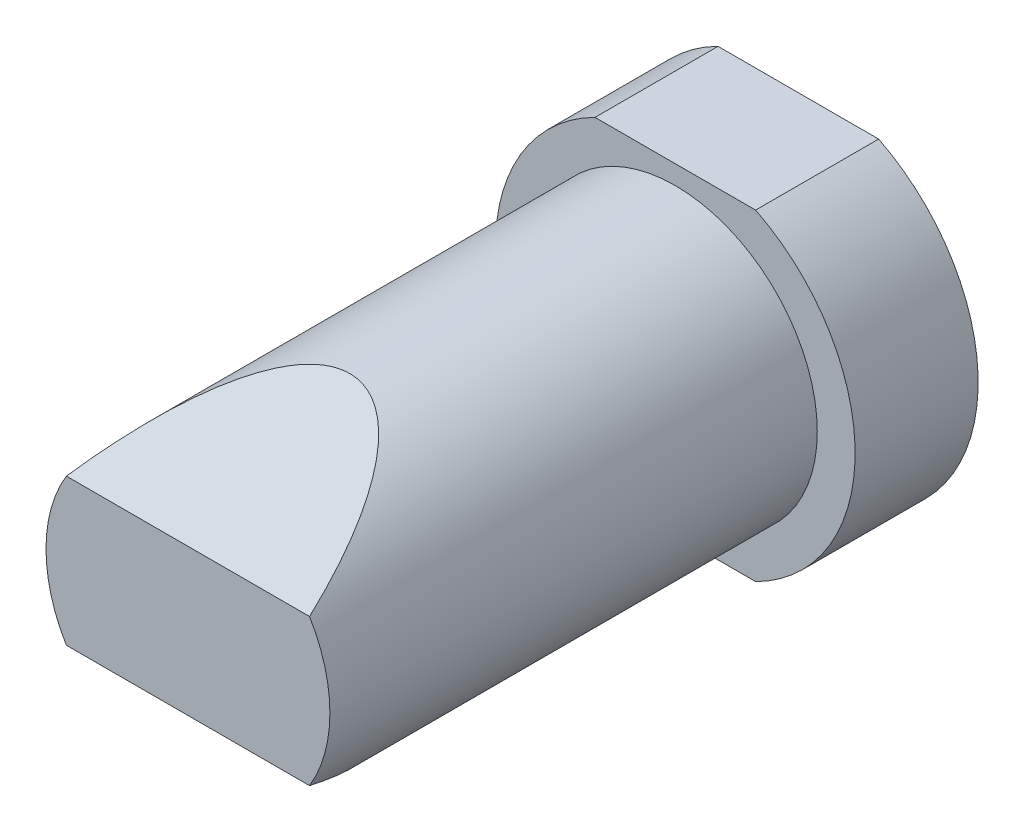
ISO-10303-21;
HEADER;
FILE_DESCRIPTION(('STEP AP214'),'2;1');
FILE_NAME('part.step','',(''),(''),'','','');
FILE_SCHEMA(('AUTOMOTIVE_DESIGN { 1 0 10303 214 1 1 1 1 }'));
ENDSEC;
DATA;
#1=APPLICATION_CONTEXT('core data for automotive mechanical design processes');
#2=APPLICATION_PROTOCOL_DEFINITION('international standard','automotive_design',2000,#1);
#3=PRODUCT_CONTEXT('',#1,'mechanical');
#4=PRODUCT('Part','Part','',(#3));
#5=PRODUCT_RELATED_PRODUCT_CATEGORY('part','',(#4));
#6=PRODUCT_DEFINITION_FORMATION('','',#4);
#7=PRODUCT_DEFINITION_CONTEXT('part definition',#1,'design');
#8=PRODUCT_DEFINITION('design','',#6,#7);
#9=PRODUCT_DEFINITION_SHAPE('','',#8);
#10=(LENGTH_UNIT() NAMED_UNIT(*) SI_UNIT(.MILLI.,.METRE.));
#11=(NAMED_UNIT(*) PLANE_ANGLE_UNIT() SI_UNIT($,.RADIAN.));
#12=(NAMED_UNIT(*) SI_UNIT($,.STERADIAN.) SOLID_ANGLE_UNIT());
#13=UNCERTAINTY_MEASURE_WITH_UNIT(LENGTH_MEASURE(1.E-05),#10,'distance_accuracy_value','');
#14=(GEOMETRIC_REPRESENTATION_CONTEXT(3) GLOBAL_UNCERTAINTY_ASSIGNED_CONTEXT((#13)) GLOBAL_UNIT_ASSIGNED_CONTEXT((#10,
#11,#12)) REPRESENTATION_CONTEXT('',''));
#15=CARTESIAN_POINT('',(0.,0.,0.));
#16=DIRECTION('',(0.,0.,1.));
#17=DIRECTION('',(1.,0.,0.));
#18=AXIS2_PLACEMENT_3D('',#15,#16,#17);
#19=CARTESIAN_POINT('',(0.,0.,-19.6666666665806));
#20=DIRECTION('',(0.,0.,-1.));
#21=DIRECTION('',(-1.,0.,0.));
#22=AXIS2_PLACEMENT_3D('',#19,#20,#21);
#23=CONICAL_SURFACE('',#22,3.99999999979173,1.04719755110444);
#24=CARTESIAN_POINT('',(0.,0.,-19.6666666667));
#25=DIRECTION('',(0.,0.,-1.));
#26=DIRECTION('',(-1.,0.,0.));
#27=AXIS2_PLACEMENT_3D('',#24,#25,#26);
#28=CIRCLE('',#27,4.);
#29=CARTESIAN_POINT('',(-4.,0.,-19.6666666667));
#30=VERTEX_POINT('',#29);
#31=EDGE_CURVE('E155',#30,#30,#28,.T.);
#32=ORIENTED_EDGE('',*,*,#31,.T.);
#33=EDGE_LOOP('',(#32));
#34=FACE_BOUND('',#33,.T.);
#35=CARTESIAN_POINT('',(0.,3.41060513164848E-10,-17.3572655898226));
#36=VERTEX_POINT('',#35);
#37=VERTEX_LOOP('',#36);
#38=FACE_BOUND('',#37,.T.);
#39=ADVANCED_FACE('F17',(#34,#38),#23,.F.);
#40=CARTESIAN_POINT('',(0.,0.,-21.33333333335));
#41=DIRECTION('',(0.,0.,-1.));
#42=DIRECTION('',(-1.,0.,0.));
#43=AXIS2_PLACEMENT_3D('',#40,#41,#42);
#44=CYLINDRICAL_SURFACE('',#43,4.);
#45=ORIENTED_EDGE('',*,*,#31,.F.);
#46=EDGE_LOOP('',(#45));
#47=FACE_BOUND('',#46,.T.);
#48=CARTESIAN_POINT('',(0.,0.,-23.));
#49=DIRECTION('',(0.,0.,-1.));
#50=DIRECTION('',(-1.,0.,0.));
#51=AXIS2_PLACEMENT_3D('',#48,#49,#50);
#52=CIRCLE('',#51,4.);
#53=CARTESIAN_POINT('',(-4.,0.,-23.));
#54=VERTEX_POINT('',#53);
#55=EDGE_CURVE('E20',#54,#54,#52,.F.);
#56=ORIENTED_EDGE('',*,*,#55,.F.);
#57=EDGE_LOOP('',(#56));
#58=FACE_BOUND('',#57,.T.);
#59=ADVANCED_FACE('F76',(#47,#58),#44,.F.);
#60=CARTESIAN_POINT('',(0.,4.4975,-23.));
#61=DIRECTION('',(0.,0.,1.));
#62=DIRECTION('',(1.,0.,0.));
#63=AXIS2_PLACEMENT_3D('',#60,#61,#62);
#64=PLANE('',#63);
#65=ORIENTED_EDGE('',*,*,#55,.T.);
#66=EDGE_LOOP('',(#65));
#67=FACE_BOUND('',#66,.T.);
#68=CARTESIAN_POINT('',(0.,0.,-23.));
#69=DIRECTION('',(0.,0.,-1.));
#70=DIRECTION('',(-1.,0.,0.));
#71=AXIS2_PLACEMENT_3D('',#68,#69,#70);
#72=CIRCLE('',#71,3.995);
#73=CARTESIAN_POINT('',(-3.995,0.,-23.));
#74=VERTEX_POINT('',#73);
#75=EDGE_CURVE('E145',#74,#74,#72,.T.);
#76=ORIENTED_EDGE('',*,*,#75,.T.);
#77=EDGE_LOOP('',(#76));
#78=FACE_BOUND('',#77,.T.);
#79=ADVANCED_FACE('F82',(#67,#78),#64,.T.);
#80=CARTESIAN_POINT('',(0.,0.,-32.4975));
#81=DIRECTION('',(0.,0.,-1.));
#82=DIRECTION('',(-1.,0.,0.));
#83=AXIS2_PLACEMENT_3D('',#80,#81,#82);
#84=CYLINDRICAL_SURFACE('',#83,3.995);
#85=CARTESIAN_POINT('',(0.,0.,-41.9949999999858));
#86=DIRECTION('',(0.,0.,-1.));
#87=DIRECTION('',(0.,1.,0.));
#88=AXIS2_PLACEMENT_3D('',#85,#86,#87);
#89=CIRCLE('',#88,3.99499999997488);
#90=CARTESIAN_POINT('',(0.,3.99499999997488,-41.9949999999858));
#91=VERTEX_POINT('',#90);
#92=EDGE_CURVE('E148',#91,#91,#89,.T.);
#93=ORIENTED_EDGE('',*,*,#92,.T.);
#94=EDGE_LOOP('',(#93));
#95=FACE_BOUND('',#94,.T.);
#96=ORIENTED_EDGE('',*,*,#75,.F.);
#97=EDGE_LOOP('',(#96));
#98=FACE_BOUND('',#97,.T.);
#99=ADVANCED_FACE('F131',(#95,#98),#84,.F.);
#100=CARTESIAN_POINT('',(0.,0.,-42.9999999998927));
#101=DIRECTION('',(0.,0.,-1.));
#102=DIRECTION('',(-1.,0.,0.));
#103=AXIS2_PLACEMENT_3D('',#100,#101,#102);
#104=CONICAL_SURFACE('',#103,4.99999999988177,0.785398163397448);
#105=CARTESIAN_POINT('',(0.,0.,-43.0000000000064));
#106=DIRECTION('',(0.,0.,-1.));
#107=DIRECTION('',(-1.,0.,0.));
#108=AXIS2_PLACEMENT_3D('',#105,#106,#107);
#109=CIRCLE('',#108,4.99999999999545);
#110=CARTESIAN_POINT('',(-4.99999999999545,0.,-43.0000000000064));
#111=VERTEX_POINT('',#110);
#112=EDGE_CURVE('E153',#111,#111,#109,.F.);
#113=ORIENTED_EDGE('',*,*,#112,.F.);
#114=EDGE_LOOP('',(#113));
#115=FACE_BOUND('',#114,.T.);
#116=ORIENTED_EDGE('',*,*,#92,.F.);
#117=EDGE_LOOP('',(#116));
#118=FACE_BOUND('',#117,.T.);
#119=ADVANCED_FACE('F127',(#115,#118),#104,.F.);
#120=CARTESIAN_POINT('',(0.,0.,-43.));
#121=DIRECTION('',(0.,0.,-1.));
#122=DIRECTION('',(-1.,0.,0.));
#123=AXIS2_PLACEMENT_3D('',#120,#121,#122);
#124=PLANE('',#123);
#125=DIRECTION('',(1.,0.,0.));
#126=VECTOR('',#125,1.);
#127=CARTESIAN_POINT('',(0.,8.5,-43.));
#128=LINE('',#127,#126);
#129=CARTESIAN_POINT('',(4.24264068711928,8.5,-43.));
#130=VERTEX_POINT('',#129);
#131=CARTESIAN_POINT('',(-4.24264068711928,8.5,-43.));
#132=VERTEX_POINT('',#131);
#133=EDGE_CURVE('E198',#130,#132,#128,.F.);
#134=ORIENTED_EDGE('',*,*,#133,.F.);
#135=CARTESIAN_POINT('',(0.,0.,-43.));
#136=DIRECTION('',(0.,0.,1.));
#137=DIRECTION('',(1.,0.,0.));
#138=AXIS2_PLACEMENT_3D('',#135,#136,#137);
#139=CIRCLE('',#138,9.5);
#140=CARTESIAN_POINT('',(4.24264068711928,-8.5,-43.));
#141=VERTEX_POINT('',#140);
#142=EDGE_CURVE('E160',#141,#130,#139,.T.);
#143=ORIENTED_EDGE('',*,*,#142,.F.);
#144=DIRECTION('',(1.,0.,0.));
#145=VECTOR('',#144,1.);
#146=CARTESIAN_POINT('',(0.,-8.5,-43.));
#147=LINE('',#146,#145);
#148=CARTESIAN_POINT('',(-4.24264068711929,-8.5,-43.));
#149=VERTEX_POINT('',#148);
#150=EDGE_CURVE('E70',#149,#141,#147,.T.);
#151=ORIENTED_EDGE('',*,*,#150,.F.);
#152=CARTESIAN_POINT('',(0.,0.,-43.));
#153=DIRECTION('',(0.,0.,1.));
#154=DIRECTION('',(1.,0.,0.));
#155=AXIS2_PLACEMENT_3D('',#152,#153,#154);
#156=CIRCLE('',#155,9.5);
#157=EDGE_CURVE('E165',#132,#149,#156,.T.);
#158=ORIENTED_EDGE('',*,*,#157,.F.);
#159=EDGE_LOOP('',(#134,#143,#151,#158));
#160=FACE_BOUND('',#159,.T.);
#161=ORIENTED_EDGE('',*,*,#112,.T.);
#162=EDGE_LOOP('',(#161));
#163=FACE_BOUND('',#162,.T.);
#164=ADVANCED_FACE('F124',(#160,#163),#124,.T.);
#165=CARTESIAN_POINT('',(0.,-8.5,-39.75));
#166=DIRECTION('',(0.,-1.,0.));
#167=DIRECTION('',(0.,0.,-1.));
#168=AXIS2_PLACEMENT_3D('',#165,#166,#167);
#169=PLANE('',#168);
#170=DIRECTION('',(0.,0.,1.));
#171=VECTOR('',#170,1.);
#172=CARTESIAN_POINT('',(4.24264068711928,-8.5,-39.75));
#173=LINE('',#172,#171);
#174=CARTESIAN_POINT('',(4.24264068711928,-8.5,-36.5));
#175=VERTEX_POINT('',#174);
#176=EDGE_CURVE('E164',#175,#141,#173,.F.);
#177=ORIENTED_EDGE('',*,*,#176,.F.);
#178=DIRECTION('',(1.,0.,0.));
#179=VECTOR('',#178,1.);
#180=CARTESIAN_POINT('',(0.,-8.5,-36.5));
#181=LINE('',#180,#179);
#182=CARTESIAN_POINT('',(-4.24264068711929,-8.5,-36.5));
#183=VERTEX_POINT('',#182);
#184=EDGE_CURVE('E174',#183,#175,#181,.T.);
#185=ORIENTED_EDGE('',*,*,#184,.F.);
#186=DIRECTION('',(0.,0.,1.));
#187=VECTOR('',#186,1.);
#188=CARTESIAN_POINT('',(-4.24264068711929,-8.5,-39.75));
#189=LINE('',#188,#187);
#190=EDGE_CURVE('E201',#149,#183,#189,.T.);
#191=ORIENTED_EDGE('',*,*,#190,.F.);
#192=ORIENTED_EDGE('',*,*,#150,.T.);
#193=EDGE_LOOP('',(#177,#185,#191,#192));
#194=FACE_BOUND('',#193,.T.);
#195=ADVANCED_FACE('F120',(#194),#169,.T.);
#196=CARTESIAN_POINT('',(0.,0.,-39.75));
#197=DIRECTION('',(0.,0.,1.));
#198=DIRECTION('',(1.,0.,0.));
#199=AXIS2_PLACEMENT_3D('',#196,#197,#198);
#200=CYLINDRICAL_SURFACE('',#199,9.5);
#201=DIRECTION('',(0.,0.,1.));
#202=VECTOR('',#201,1.);
#203=CARTESIAN_POINT('',(4.24264068711928,8.5,-39.75));
#204=LINE('',#203,#202);
#205=CARTESIAN_POINT('',(4.24264068711928,8.5,-36.5));
#206=VERTEX_POINT('',#205);
#207=EDGE_CURVE('E163',#206,#130,#204,.F.);
#208=ORIENTED_EDGE('',*,*,#207,.F.);
#209=CARTESIAN_POINT('',(0.,0.,-36.5));
#210=DIRECTION('',(0.,0.,1.));
#211=DIRECTION('',(1.,0.,0.));
#212=AXIS2_PLACEMENT_3D('',#209,#210,#211);
#213=CIRCLE('',#212,9.5);
#214=EDGE_CURVE('E175',#175,#206,#213,.T.);
#215=ORIENTED_EDGE('',*,*,#214,.F.);
#216=ORIENTED_EDGE('',*,*,#176,.T.);
#217=ORIENTED_EDGE('',*,*,#142,.T.);
#218=EDGE_LOOP('',(#208,#215,#216,#217));
#219=FACE_BOUND('',#218,.T.);
#220=ADVANCED_FACE('F116',(#219),#200,.T.);
#221=CARTESIAN_POINT('',(0.,8.5,-39.75));
#222=DIRECTION('',(0.,1.,0.));
#223=DIRECTION('',(0.,0.,1.));
#224=AXIS2_PLACEMENT_3D('',#221,#222,#223);
#225=PLANE('',#224);
#226=DIRECTION('',(0.,0.,1.));
#227=VECTOR('',#226,1.);
#228=CARTESIAN_POINT('',(-4.24264068711928,8.5,-39.75));
#229=LINE('',#228,#227);
#230=CARTESIAN_POINT('',(-4.24264068711928,8.5,-36.5));
#231=VERTEX_POINT('',#230);
#232=EDGE_CURVE('E170',#231,#132,#229,.F.);
#233=ORIENTED_EDGE('',*,*,#232,.F.);
#234=DIRECTION('',(1.,0.,0.));
#235=VECTOR('',#234,1.);
#236=CARTESIAN_POINT('',(0.,8.5,-36.5));
#237=LINE('',#236,#235);
#238=EDGE_CURVE('E179',#206,#231,#237,.F.);
#239=ORIENTED_EDGE('',*,*,#238,.F.);
#240=ORIENTED_EDGE('',*,*,#207,.T.);
#241=ORIENTED_EDGE('',*,*,#133,.T.);
#242=EDGE_LOOP('',(#233,#239,#240,#241));
#243=FACE_BOUND('',#242,.T.);
#244=ADVANCED_FACE('F112',(#243),#225,.T.);
#245=CARTESIAN_POINT('',(0.,0.,-39.75));
#246=DIRECTION('',(0.,0.,1.));
#247=DIRECTION('',(1.,0.,0.));
#248=AXIS2_PLACEMENT_3D('',#245,#246,#247);
#249=CYLINDRICAL_SURFACE('',#248,9.5);
#250=ORIENTED_EDGE('',*,*,#232,.T.);
#251=ORIENTED_EDGE('',*,*,#157,.T.);
#252=ORIENTED_EDGE('',*,*,#190,.T.);
#253=CARTESIAN_POINT('',(0.,0.,-36.5));
#254=DIRECTION('',(0.,0.,1.));
#255=DIRECTION('',(1.,0.,0.));
#256=AXIS2_PLACEMENT_3D('',#253,#254,#255);
#257=CIRCLE('',#256,9.5);
#258=EDGE_CURVE('E180',#231,#183,#257,.T.);
#259=ORIENTED_EDGE('',*,*,#258,.F.);
#260=EDGE_LOOP('',(#250,#251,#252,#259));
#261=FACE_BOUND('',#260,.T.);
#262=ADVANCED_FACE('F108',(#261),#249,.T.);
#263=CARTESIAN_POINT('',(0.,5.25,-14.));
#264=DIRECTION('',(0.,0.920504853455843,0.390731128481257));
#265=DIRECTION('',(0.,-0.390731128481257,0.920504853455843));
#266=AXIS2_PLACEMENT_3D('',#263,#264,#265);
#267=PLANE('',#266);
#268=DIRECTION('',(1.,0.,0.));
#269=VECTOR('',#268,1.);
#270=CARTESIAN_POINT('',(0.,3.87045684735219,-10.75));
#271=LINE('',#270,#269);
#272=CARTESIAN_POINT('',(6.42413914799365,3.87045684735219,-10.75));
#273=VERTEX_POINT('',#272);
#274=CARTESIAN_POINT('',(-6.42413914799365,3.87045684735219,-10.75));
#275=VERTEX_POINT('',#274);
#276=EDGE_CURVE('E169',#273,#275,#271,.F.);
#277=ORIENTED_EDGE('',*,*,#276,.F.);
#278=CARTESIAN_POINT('',(0.,0.,-1.63177507912582));
#279=DIRECTION('',(0.,0.920504853455843,0.390731128481257));
#280=DIRECTION('',(0.,-0.390731128481257,0.920504853455843));
#281=AXIS2_PLACEMENT_3D('',#278,#279,#280);
#282=ELLIPSE('',#281,19.1947849897497,7.5);
#283=EDGE_CURVE('E184',#275,#273,#282,.F.);
#284=ORIENTED_EDGE('',*,*,#283,.F.);
#285=EDGE_LOOP('',(#277,#284));
#286=FACE_BOUND('',#285,.T.);
#287=ADVANCED_FACE('F105',(#286),#267,.T.);
#288=CARTESIAN_POINT('',(0.,0.,-10.75));
#289=DIRECTION('',(0.,0.,1.));
#290=DIRECTION('',(1.,0.,0.));
#291=AXIS2_PLACEMENT_3D('',#288,#289,#290);
#292=PLANE('',#291);
#293=ORIENTED_EDGE('',*,*,#276,.T.);
#294=CARTESIAN_POINT('',(0.,0.,-10.75));
#295=DIRECTION('',(0.,0.,1.));
#296=DIRECTION('',(1.,0.,0.));
#297=AXIS2_PLACEMENT_3D('',#294,#295,#296);
#298=CIRCLE('',#297,7.5);
#299=CARTESIAN_POINT('',(-6.42413914799365,-3.87045684735219,-10.75));
#300=VERTEX_POINT('',#299);
#301=EDGE_CURVE('E171',#300,#275,#298,.F.);
#302=ORIENTED_EDGE('',*,*,#301,.F.);
#303=DIRECTION('',(1.,0.,0.));
#304=VECTOR('',#303,1.);
#305=CARTESIAN_POINT('',(0.,-3.87045684735219,-10.75));
#306=LINE('',#305,#304);
#307=CARTESIAN_POINT('',(6.42413914799365,-3.87045684735219,-10.75));
#308=VERTEX_POINT('',#307);
#309=EDGE_CURVE('E36',#308,#300,#306,.F.);
#310=ORIENTED_EDGE('',*,*,#309,.F.);
#311=CARTESIAN_POINT('',(0.,0.,-10.75));
#312=DIRECTION('',(0.,0.,1.));
#313=DIRECTION('',(1.,0.,0.));
#314=AXIS2_PLACEMENT_3D('',#311,#312,#313);
#315=CIRCLE('',#314,7.5);
#316=EDGE_CURVE('E188',#273,#308,#315,.F.);
#317=ORIENTED_EDGE('',*,*,#316,.F.);
#318=EDGE_LOOP('',(#293,#302,#310,#317));
#319=FACE_BOUND('',#318,.T.);
#320=ADVANCED_FACE('F101',(#319),#292,.T.);
#321=CARTESIAN_POINT('',(0.,-5.25,-14.));
#322=DIRECTION('',(0.,-0.920504853455843,0.390731128481257));
#323=DIRECTION('',(0.,-0.390731128481257,-0.920504853455843));
#324=AXIS2_PLACEMENT_3D('',#321,#322,#323);
#325=PLANE('',#324);
#326=ORIENTED_EDGE('',*,*,#309,.T.);
#327=CARTESIAN_POINT('',(0.,0.,-1.63177507912582));
#328=DIRECTION('',(0.,-0.920504853455843,0.390731128481257));
#329=DIRECTION('',(0.,0.390731128481257,0.920504853455843));
#330=AXIS2_PLACEMENT_3D('',#327,#328,#329);
#331=ELLIPSE('',#330,19.1947849897497,7.5);
#332=EDGE_CURVE('E27',#308,#300,#331,.F.);
#333=ORIENTED_EDGE('',*,*,#332,.F.);
#334=EDGE_LOOP('',(#326,#333));
#335=FACE_BOUND('',#334,.T.);
#336=ADVANCED_FACE('F93',(#335),#325,.T.);
#337=CARTESIAN_POINT('',(0.,0.,-36.5));
#338=DIRECTION('',(0.,0.,1.));
#339=DIRECTION('',(1.,0.,0.));
#340=AXIS2_PLACEMENT_3D('',#337,#338,#339);
#341=PLANE('',#340);
#342=ORIENTED_EDGE('',*,*,#238,.T.);
#343=ORIENTED_EDGE('',*,*,#258,.T.);
#344=ORIENTED_EDGE('',*,*,#184,.T.);
#345=ORIENTED_EDGE('',*,*,#214,.T.);
#346=EDGE_LOOP('',(#342,#343,#344,#345));
#347=FACE_BOUND('',#346,.T.);
#348=CARTESIAN_POINT('',(0.,0.,-36.5));
#349=DIRECTION('',(0.,0.,1.));
#350=DIRECTION('',(1.,0.,0.));
#351=AXIS2_PLACEMENT_3D('',#348,#349,#350);
#352=CIRCLE('',#351,7.5);
#353=CARTESIAN_POINT('',(7.5,0.,-36.5));
#354=VERTEX_POINT('',#353);
#355=EDGE_CURVE('E11',#354,#354,#352,.T.);
#356=ORIENTED_EDGE('',*,*,#355,.F.);
#357=EDGE_LOOP('',(#356));
#358=FACE_BOUND('',#357,.T.);
#359=ADVANCED_FACE('F87',(#347,#358),#341,.T.);
#360=CARTESIAN_POINT('',(0.,0.,-23.625));
#361=DIRECTION('',(0.,0.,1.));
#362=DIRECTION('',(1.,0.,0.));
#363=AXIS2_PLACEMENT_3D('',#360,#361,#362);
#364=CYLINDRICAL_SURFACE('',#363,7.5);
#365=ORIENTED_EDGE('',*,*,#301,.T.);
#366=ORIENTED_EDGE('',*,*,#283,.T.);
#367=ORIENTED_EDGE('',*,*,#316,.T.);
#368=ORIENTED_EDGE('',*,*,#332,.T.);
#369=EDGE_LOOP('',(#365,#366,#367,#368));
#370=FACE_BOUND('',#369,.T.);
#371=ORIENTED_EDGE('',*,*,#355,.T.);
#372=EDGE_LOOP('',(#371));
#373=FACE_BOUND('',#372,.T.);
#374=ADVANCED_FACE('F85',(#370,#373),#364,.T.);
#375=CLOSED_SHELL('',(#39,#59,#79,#99,#119,#164,#195,#220,#244,#262,#287,#320,#336,#359,#374));
#376=MANIFOLD_SOLID_BREP('B1',#375);
#377=ADVANCED_BREP_SHAPE_REPRESENTATION('',(#18,#376),#14);
#378=SHAPE_DEFINITION_REPRESENTATION(#9,#377);
ENDSEC;
END-ISO-10303-21;
